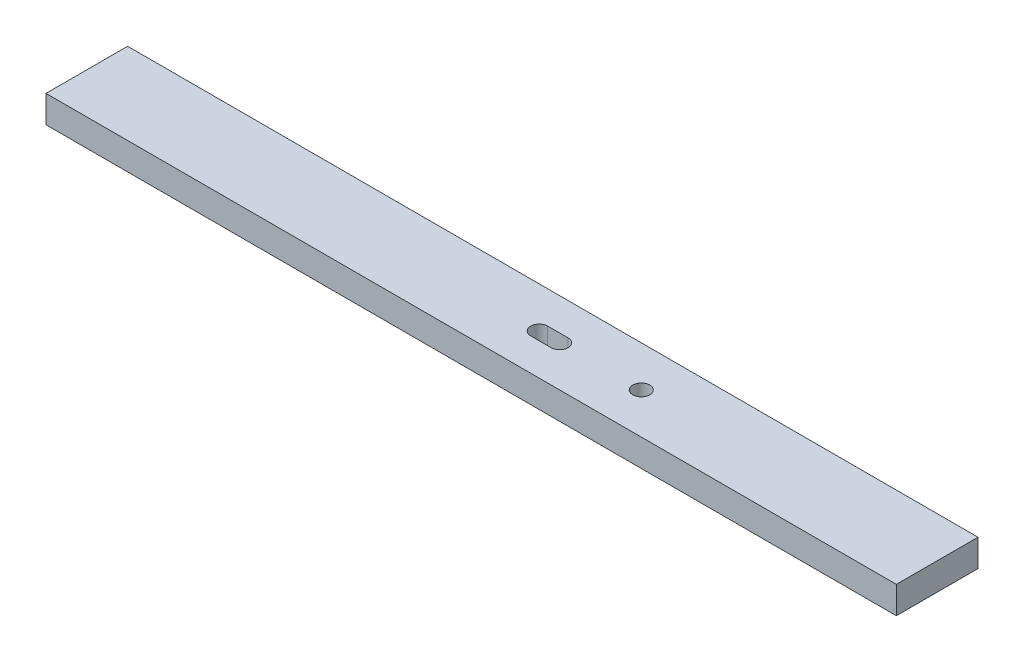
ISO-10303-21;
HEADER;
FILE_DESCRIPTION(('STEP AP214'),'2;1');
FILE_NAME('part.step','',(''),(''),'','','');
FILE_SCHEMA(('AUTOMOTIVE_DESIGN { 1 0 10303 214 1 1 1 1 }'));
ENDSEC;
DATA;
#1=APPLICATION_CONTEXT('core data for automotive mechanical design processes');
#2=APPLICATION_PROTOCOL_DEFINITION('international standard','automotive_design',2000,#1);
#3=PRODUCT_CONTEXT('',#1,'mechanical');
#4=PRODUCT('Part','Part','',(#3));
#5=PRODUCT_RELATED_PRODUCT_CATEGORY('part','',(#4));
#6=PRODUCT_DEFINITION_FORMATION('','',#4);
#7=PRODUCT_DEFINITION_CONTEXT('part definition',#1,'design');
#8=PRODUCT_DEFINITION('design','',#6,#7);
#9=PRODUCT_DEFINITION_SHAPE('','',#8);
#10=(LENGTH_UNIT() NAMED_UNIT(*) SI_UNIT(.MILLI.,.METRE.));
#11=(NAMED_UNIT(*) PLANE_ANGLE_UNIT() SI_UNIT($,.RADIAN.));
#12=(NAMED_UNIT(*) SI_UNIT($,.STERADIAN.) SOLID_ANGLE_UNIT());
#13=UNCERTAINTY_MEASURE_WITH_UNIT(LENGTH_MEASURE(1.E-05),#10,'distance_accuracy_value','');
#14=(GEOMETRIC_REPRESENTATION_CONTEXT(3) GLOBAL_UNCERTAINTY_ASSIGNED_CONTEXT((#13)) GLOBAL_UNIT_ASSIGNED_CONTEXT((#10,
#11,#12)) REPRESENTATION_CONTEXT('',''));
#15=CARTESIAN_POINT('',(0.,0.,0.));
#16=DIRECTION('',(0.,0.,1.));
#17=DIRECTION('',(1.,0.,0.));
#18=AXIS2_PLACEMENT_3D('',#15,#16,#17);
#19=CARTESIAN_POINT('',(250.,-4.,-12.));
#20=DIRECTION('',(0.,0.,1.));
#21=DIRECTION('',(1.,0.,0.));
#22=AXIS2_PLACEMENT_3D('',#19,#20,#21);
#23=PLANE('',#22);
#24=DIRECTION('',(0.,1.,0.));
#25=VECTOR('',#24,1.);
#26=CARTESIAN_POINT('',(0.,-4.,-12.));
#27=LINE('',#26,#25);
#28=CARTESIAN_POINT('',(0.,-4.,-12.));
#29=VERTEX_POINT('',#28);
#30=CARTESIAN_POINT('',(0.,4.,-12.));
#31=VERTEX_POINT('',#30);
#32=EDGE_CURVE('E167',#29,#31,#27,.T.);
#33=ORIENTED_EDGE('',*,*,#32,.T.);
#34=DIRECTION('',(-1.,0.,0.));
#35=VECTOR('',#34,1.);
#36=CARTESIAN_POINT('',(250.,4.,-12.));
#37=LINE('',#36,#35);
#38=CARTESIAN_POINT('',(250.,4.,-12.));
#39=VERTEX_POINT('',#38);
#40=EDGE_CURVE('E11',#39,#31,#37,.T.);
#41=ORIENTED_EDGE('',*,*,#40,.F.);
#42=DIRECTION('',(0.,1.,0.));
#43=VECTOR('',#42,1.);
#44=CARTESIAN_POINT('',(250.,-4.,-12.));
#45=LINE('',#44,#43);
#46=CARTESIAN_POINT('',(250.,-4.,-12.));
#47=VERTEX_POINT('',#46);
#48=EDGE_CURVE('E152',#47,#39,#45,.T.);
#49=ORIENTED_EDGE('',*,*,#48,.F.);
#50=DIRECTION('',(-1.,0.,0.));
#51=VECTOR('',#50,1.);
#52=CARTESIAN_POINT('',(250.,-4.,-12.));
#53=LINE('',#52,#51);
#54=EDGE_CURVE('E166',#47,#29,#53,.T.);
#55=ORIENTED_EDGE('',*,*,#54,.T.);
#56=EDGE_LOOP('',(#33,#41,#49,#55));
#57=FACE_BOUND('',#56,.T.);
#58=ADVANCED_FACE('F39',(#57),#23,.F.);
#59=CARTESIAN_POINT('',(250.,4.,12.));
#60=DIRECTION('',(0.,-1.,0.));
#61=DIRECTION('',(0.,0.,-1.));
#62=AXIS2_PLACEMENT_3D('',#59,#60,#61);
#63=PLANE('',#62);
#64=CARTESIAN_POINT('',(163.,4.,0.));
#65=DIRECTION('',(0.,1.,0.));
#66=DIRECTION('',(0.,0.,1.));
#67=AXIS2_PLACEMENT_3D('',#64,#65,#66);
#68=CIRCLE('',#67,2.5);
#69=CARTESIAN_POINT('',(163.,4.,2.5));
#70=VERTEX_POINT('',#69);
#71=EDGE_CURVE('E147',#70,#70,#68,.T.);
#72=ORIENTED_EDGE('',*,*,#71,.F.);
#73=EDGE_LOOP('',(#72));
#74=FACE_BOUND('',#73,.T.);
#75=DIRECTION('',(1.,0.,0.));
#76=VECTOR('',#75,1.);
#77=CARTESIAN_POINT('',(133.,4.,2.5));
#78=LINE('',#77,#76);
#79=CARTESIAN_POINT('',(133.,4.,2.5));
#80=VERTEX_POINT('',#79);
#81=CARTESIAN_POINT('',(139.,4.,2.5));
#82=VERTEX_POINT('',#81);
#83=EDGE_CURVE('E116',#80,#82,#78,.T.);
#84=ORIENTED_EDGE('',*,*,#83,.F.);
#85=CARTESIAN_POINT('',(133.,4.,0.));
#86=DIRECTION('',(0.,1.,0.));
#87=DIRECTION('',(0.,0.,1.));
#88=AXIS2_PLACEMENT_3D('',#85,#86,#87);
#89=CIRCLE('',#88,2.5);
#90=CARTESIAN_POINT('',(133.,4.,-2.5));
#91=VERTEX_POINT('',#90);
#92=EDGE_CURVE('E54',#91,#80,#89,.T.);
#93=ORIENTED_EDGE('',*,*,#92,.F.);
#94=DIRECTION('',(-1.,0.,0.));
#95=VECTOR('',#94,1.);
#96=CARTESIAN_POINT('',(133.,4.,-2.5));
#97=LINE('',#96,#95);
#98=CARTESIAN_POINT('',(139.,4.,-2.5));
#99=VERTEX_POINT('',#98);
#100=EDGE_CURVE('E124',#99,#91,#97,.T.);
#101=ORIENTED_EDGE('',*,*,#100,.F.);
#102=CARTESIAN_POINT('',(139.,4.,0.));
#103=DIRECTION('',(0.,1.,0.));
#104=DIRECTION('',(0.,0.,1.));
#105=AXIS2_PLACEMENT_3D('',#102,#103,#104);
#106=CIRCLE('',#105,2.5);
#107=EDGE_CURVE('E106',#82,#99,#106,.T.);
#108=ORIENTED_EDGE('',*,*,#107,.F.);
#109=EDGE_LOOP('',(#84,#93,#101,#108));
#110=FACE_BOUND('',#109,.T.);
#111=DIRECTION('',(0.,0.,1.));
#112=VECTOR('',#111,1.);
#113=CARTESIAN_POINT('',(0.,4.,12.));
#114=LINE('',#113,#112);
#115=CARTESIAN_POINT('',(0.,4.,12.));
#116=VERTEX_POINT('',#115);
#117=EDGE_CURVE('E171',#31,#116,#114,.T.);
#118=ORIENTED_EDGE('',*,*,#117,.T.);
#119=DIRECTION('',(-1.,0.,0.));
#120=VECTOR('',#119,1.);
#121=CARTESIAN_POINT('',(250.,4.,12.));
#122=LINE('',#121,#120);
#123=CARTESIAN_POINT('',(250.,4.,12.));
#124=VERTEX_POINT('',#123);
#125=EDGE_CURVE('E47',#124,#116,#122,.T.);
#126=ORIENTED_EDGE('',*,*,#125,.F.);
#127=DIRECTION('',(0.,0.,1.));
#128=VECTOR('',#127,1.);
#129=CARTESIAN_POINT('',(250.,4.,12.));
#130=LINE('',#129,#128);
#131=EDGE_CURVE('E156',#39,#124,#130,.T.);
#132=ORIENTED_EDGE('',*,*,#131,.F.);
#133=ORIENTED_EDGE('',*,*,#40,.T.);
#134=EDGE_LOOP('',(#118,#126,#132,#133));
#135=FACE_BOUND('',#134,.T.);
#136=ADVANCED_FACE('F121',(#74,#110,#135),#63,.F.);
#137=CARTESIAN_POINT('',(250.,-4.,12.));
#138=DIRECTION('',(0.,0.,-1.));
#139=DIRECTION('',(-1.,0.,0.));
#140=AXIS2_PLACEMENT_3D('',#137,#138,#139);
#141=PLANE('',#140);
#142=DIRECTION('',(0.,-1.,0.));
#143=VECTOR('',#142,1.);
#144=CARTESIAN_POINT('',(0.,-4.,12.));
#145=LINE('',#144,#143);
#146=CARTESIAN_POINT('',(0.,-4.,12.));
#147=VERTEX_POINT('',#146);
#148=EDGE_CURVE('E175',#116,#147,#145,.T.);
#149=ORIENTED_EDGE('',*,*,#148,.T.);
#150=DIRECTION('',(-1.,0.,0.));
#151=VECTOR('',#150,1.);
#152=CARTESIAN_POINT('',(250.,-4.,12.));
#153=LINE('',#152,#151);
#154=CARTESIAN_POINT('',(250.,-4.,12.));
#155=VERTEX_POINT('',#154);
#156=EDGE_CURVE('E183',#155,#147,#153,.T.);
#157=ORIENTED_EDGE('',*,*,#156,.F.);
#158=DIRECTION('',(0.,-1.,0.));
#159=VECTOR('',#158,1.);
#160=CARTESIAN_POINT('',(250.,-4.,12.));
#161=LINE('',#160,#159);
#162=EDGE_CURVE('E160',#124,#155,#161,.T.);
#163=ORIENTED_EDGE('',*,*,#162,.F.);
#164=ORIENTED_EDGE('',*,*,#125,.T.);
#165=EDGE_LOOP('',(#149,#157,#163,#164));
#166=FACE_BOUND('',#165,.T.);
#167=ADVANCED_FACE('F192',(#166),#141,.F.);
#168=CARTESIAN_POINT('',(250.,-4.,12.));
#169=DIRECTION('',(0.,1.,0.));
#170=DIRECTION('',(0.,0.,1.));
#171=AXIS2_PLACEMENT_3D('',#168,#169,#170);
#172=PLANE('',#171);
#173=CARTESIAN_POINT('',(163.,-4.,0.));
#174=DIRECTION('',(0.,1.,0.));
#175=DIRECTION('',(0.,0.,1.));
#176=AXIS2_PLACEMENT_3D('',#173,#174,#175);
#177=CIRCLE('',#176,2.5);
#178=CARTESIAN_POINT('',(163.,-4.,2.5));
#179=VERTEX_POINT('',#178);
#180=EDGE_CURVE('E172',#179,#179,#177,.T.);
#181=ORIENTED_EDGE('',*,*,#180,.T.);
#182=EDGE_LOOP('',(#181));
#183=FACE_BOUND('',#182,.T.);
#184=DIRECTION('',(-1.,0.,0.));
#185=VECTOR('',#184,1.);
#186=CARTESIAN_POINT('',(133.,-4.,-2.5));
#187=LINE('',#186,#185);
#188=CARTESIAN_POINT('',(139.,-4.,-2.5));
#189=VERTEX_POINT('',#188);
#190=CARTESIAN_POINT('',(133.,-4.,-2.5));
#191=VERTEX_POINT('',#190);
#192=EDGE_CURVE('E140',#189,#191,#187,.T.);
#193=ORIENTED_EDGE('',*,*,#192,.T.);
#194=CARTESIAN_POINT('',(133.,-4.,0.));
#195=DIRECTION('',(0.,1.,0.));
#196=DIRECTION('',(0.,0.,1.));
#197=AXIS2_PLACEMENT_3D('',#194,#195,#196);
#198=CIRCLE('',#197,2.5);
#199=CARTESIAN_POINT('',(133.,-4.,2.5));
#200=VERTEX_POINT('',#199);
#201=EDGE_CURVE('E128',#191,#200,#198,.T.);
#202=ORIENTED_EDGE('',*,*,#201,.T.);
#203=DIRECTION('',(1.,0.,0.));
#204=VECTOR('',#203,1.);
#205=CARTESIAN_POINT('',(133.,-4.,2.5));
#206=LINE('',#205,#204);
#207=CARTESIAN_POINT('',(139.,-4.,2.5));
#208=VERTEX_POINT('',#207);
#209=EDGE_CURVE('E135',#200,#208,#206,.T.);
#210=ORIENTED_EDGE('',*,*,#209,.T.);
#211=CARTESIAN_POINT('',(139.,-4.,0.));
#212=DIRECTION('',(0.,1.,0.));
#213=DIRECTION('',(0.,0.,1.));
#214=AXIS2_PLACEMENT_3D('',#211,#212,#213);
#215=CIRCLE('',#214,2.5);
#216=EDGE_CURVE('E62',#208,#189,#215,.T.);
#217=ORIENTED_EDGE('',*,*,#216,.T.);
#218=EDGE_LOOP('',(#193,#202,#210,#217));
#219=FACE_BOUND('',#218,.T.);
#220=DIRECTION('',(0.,0.,-1.));
#221=VECTOR('',#220,1.);
#222=CARTESIAN_POINT('',(0.,-4.,12.));
#223=LINE('',#222,#221);
#224=EDGE_CURVE('E157',#147,#29,#223,.T.);
#225=ORIENTED_EDGE('',*,*,#224,.T.);
#226=ORIENTED_EDGE('',*,*,#54,.F.);
#227=DIRECTION('',(0.,0.,-1.));
#228=VECTOR('',#227,1.);
#229=CARTESIAN_POINT('',(250.,-4.,12.));
#230=LINE('',#229,#228);
#231=EDGE_CURVE('E163',#155,#47,#230,.T.);
#232=ORIENTED_EDGE('',*,*,#231,.F.);
#233=ORIENTED_EDGE('',*,*,#156,.T.);
#234=EDGE_LOOP('',(#225,#226,#232,#233));
#235=FACE_BOUND('',#234,.T.);
#236=ADVANCED_FACE('F200',(#183,#219,#235),#172,.F.);
#237=CARTESIAN_POINT('',(250.,0.,0.));
#238=DIRECTION('',(-1.,0.,0.));
#239=DIRECTION('',(0.,0.,1.));
#240=AXIS2_PLACEMENT_3D('',#237,#238,#239);
#241=PLANE('',#240);
#242=ORIENTED_EDGE('',*,*,#48,.T.);
#243=ORIENTED_EDGE('',*,*,#131,.T.);
#244=ORIENTED_EDGE('',*,*,#162,.T.);
#245=ORIENTED_EDGE('',*,*,#231,.T.);
#246=EDGE_LOOP('',(#242,#243,#244,#245));
#247=FACE_BOUND('',#246,.T.);
#248=ADVANCED_FACE('F206',(#247),#241,.F.);
#249=CARTESIAN_POINT('',(0.,0.,0.));
#250=DIRECTION('',(-1.,0.,0.));
#251=DIRECTION('',(0.,0.,1.));
#252=AXIS2_PLACEMENT_3D('',#249,#250,#251);
#253=PLANE('',#252);
#254=ORIENTED_EDGE('',*,*,#32,.F.);
#255=ORIENTED_EDGE('',*,*,#224,.F.);
#256=ORIENTED_EDGE('',*,*,#148,.F.);
#257=ORIENTED_EDGE('',*,*,#117,.F.);
#258=EDGE_LOOP('',(#254,#255,#256,#257));
#259=FACE_BOUND('',#258,.T.);
#260=ADVANCED_FACE('F197',(#259),#253,.T.);
#261=CARTESIAN_POINT('',(133.,-4.,0.));
#262=DIRECTION('',(0.,1.,0.));
#263=DIRECTION('',(0.,0.,1.));
#264=AXIS2_PLACEMENT_3D('',#261,#262,#263);
#265=CYLINDRICAL_SURFACE('',#264,2.5);
#266=DIRECTION('',(0.,1.,0.));
#267=VECTOR('',#266,1.);
#268=CARTESIAN_POINT('',(133.,-4.,2.5));
#269=LINE('',#268,#267);
#270=EDGE_CURVE('E113',#200,#80,#269,.T.);
#271=ORIENTED_EDGE('',*,*,#270,.F.);
#272=ORIENTED_EDGE('',*,*,#201,.F.);
#273=DIRECTION('',(0.,1.,0.));
#274=VECTOR('',#273,1.);
#275=CARTESIAN_POINT('',(133.,-4.,-2.5));
#276=LINE('',#275,#274);
#277=EDGE_CURVE('E144',#191,#91,#276,.T.);
#278=ORIENTED_EDGE('',*,*,#277,.T.);
#279=ORIENTED_EDGE('',*,*,#92,.T.);
#280=EDGE_LOOP('',(#271,#272,#278,#279));
#281=FACE_BOUND('',#280,.T.);
#282=ADVANCED_FACE('F221',(#281),#265,.F.);
#283=CARTESIAN_POINT('',(133.,-4.,-2.5));
#284=DIRECTION('',(0.,0.,-1.));
#285=DIRECTION('',(-1.,0.,0.));
#286=AXIS2_PLACEMENT_3D('',#283,#284,#285);
#287=PLANE('',#286);
#288=ORIENTED_EDGE('',*,*,#277,.F.);
#289=ORIENTED_EDGE('',*,*,#192,.F.);
#290=DIRECTION('',(0.,1.,0.));
#291=VECTOR('',#290,1.);
#292=CARTESIAN_POINT('',(139.,-4.,-2.5));
#293=LINE('',#292,#291);
#294=EDGE_CURVE('E112',#189,#99,#293,.T.);
#295=ORIENTED_EDGE('',*,*,#294,.T.);
#296=ORIENTED_EDGE('',*,*,#100,.T.);
#297=EDGE_LOOP('',(#288,#289,#295,#296));
#298=FACE_BOUND('',#297,.T.);
#299=ADVANCED_FACE('F226',(#298),#287,.F.);
#300=CARTESIAN_POINT('',(139.,-4.,0.));
#301=DIRECTION('',(0.,1.,0.));
#302=DIRECTION('',(0.,0.,1.));
#303=AXIS2_PLACEMENT_3D('',#300,#301,#302);
#304=CYLINDRICAL_SURFACE('',#303,2.5);
#305=ORIENTED_EDGE('',*,*,#294,.F.);
#306=ORIENTED_EDGE('',*,*,#216,.F.);
#307=DIRECTION('',(0.,1.,0.));
#308=VECTOR('',#307,1.);
#309=CARTESIAN_POINT('',(139.,-4.,2.5));
#310=LINE('',#309,#308);
#311=EDGE_CURVE('E102',#208,#82,#310,.T.);
#312=ORIENTED_EDGE('',*,*,#311,.T.);
#313=ORIENTED_EDGE('',*,*,#107,.T.);
#314=EDGE_LOOP('',(#305,#306,#312,#313));
#315=FACE_BOUND('',#314,.T.);
#316=ADVANCED_FACE('F104',(#315),#304,.F.);
#317=CARTESIAN_POINT('',(133.,-4.,2.5));
#318=DIRECTION('',(0.,0.,1.));
#319=DIRECTION('',(1.,0.,0.));
#320=AXIS2_PLACEMENT_3D('',#317,#318,#319);
#321=PLANE('',#320);
#322=ORIENTED_EDGE('',*,*,#311,.F.);
#323=ORIENTED_EDGE('',*,*,#209,.F.);
#324=ORIENTED_EDGE('',*,*,#270,.T.);
#325=ORIENTED_EDGE('',*,*,#83,.T.);
#326=EDGE_LOOP('',(#322,#323,#324,#325));
#327=FACE_BOUND('',#326,.T.);
#328=ADVANCED_FACE('F117',(#327),#321,.F.);
#329=CARTESIAN_POINT('',(163.,-4.,0.));
#330=DIRECTION('',(0.,1.,0.));
#331=DIRECTION('',(0.,0.,1.));
#332=AXIS2_PLACEMENT_3D('',#329,#330,#331);
#333=CYLINDRICAL_SURFACE('',#332,2.5);
#334=ORIENTED_EDGE('',*,*,#180,.F.);
#335=EDGE_LOOP('',(#334));
#336=FACE_BOUND('',#335,.T.);
#337=ORIENTED_EDGE('',*,*,#71,.T.);
#338=EDGE_LOOP('',(#337));
#339=FACE_BOUND('',#338,.T.);
#340=ADVANCED_FACE('F229',(#336,#339),#333,.F.);
#341=CLOSED_SHELL('',(#58,#136,#167,#236,#248,#260,#282,#299,#316,#328,#340));
#342=MANIFOLD_SOLID_BREP('B2',#341);
#343=ADVANCED_BREP_SHAPE_REPRESENTATION('',(#18,#342),#14);
#344=SHAPE_DEFINITION_REPRESENTATION(#9,#343);
ENDSEC;
END-ISO-10303-21;
